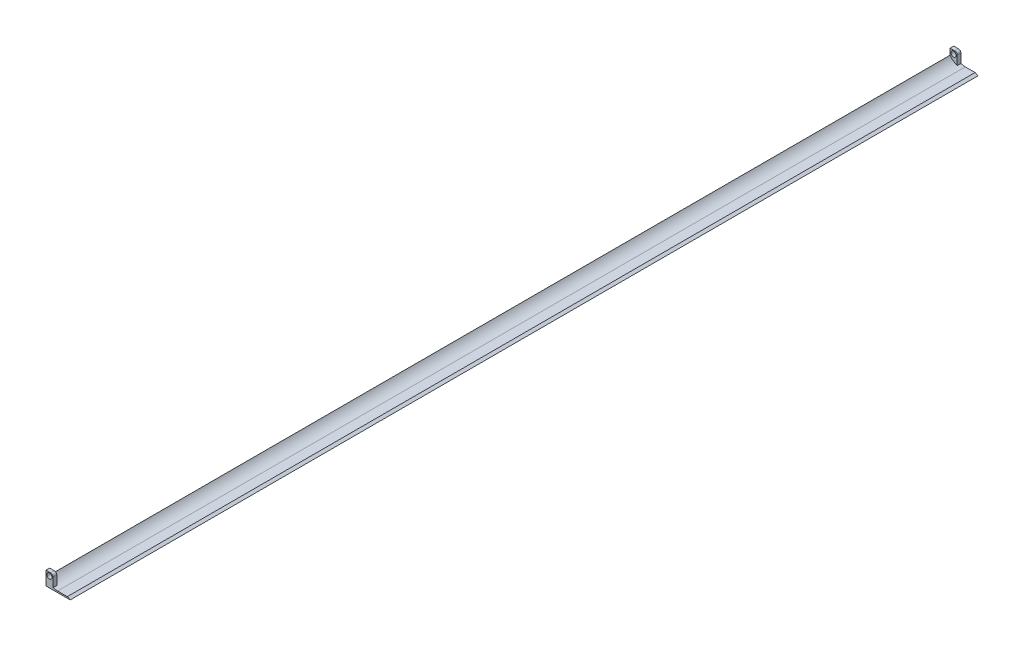
ISO-10303-21;
HEADER;
FILE_DESCRIPTION(('STEP AP214'),'2;1');
FILE_NAME('part.step','',(''),(''),'','','');
FILE_SCHEMA(('AUTOMOTIVE_DESIGN { 1 0 10303 214 1 1 1 1 }'));
ENDSEC;
DATA;
#1=APPLICATION_CONTEXT('core data for automotive mechanical design processes');
#2=APPLICATION_PROTOCOL_DEFINITION('international standard','automotive_design',2000,#1);
#3=PRODUCT_CONTEXT('',#1,'mechanical');
#4=PRODUCT('Part','Part','',(#3));
#5=PRODUCT_RELATED_PRODUCT_CATEGORY('part','',(#4));
#6=PRODUCT_DEFINITION_FORMATION('','',#4);
#7=PRODUCT_DEFINITION_CONTEXT('part definition',#1,'design');
#8=PRODUCT_DEFINITION('design','',#6,#7);
#9=PRODUCT_DEFINITION_SHAPE('','',#8);
#10=(LENGTH_UNIT() NAMED_UNIT(*) SI_UNIT(.MILLI.,.METRE.));
#11=(NAMED_UNIT(*) PLANE_ANGLE_UNIT() SI_UNIT($,.RADIAN.));
#12=(NAMED_UNIT(*) SI_UNIT($,.STERADIAN.) SOLID_ANGLE_UNIT());
#13=UNCERTAINTY_MEASURE_WITH_UNIT(LENGTH_MEASURE(1.E-05),#10,'distance_accuracy_value','');
#14=(GEOMETRIC_REPRESENTATION_CONTEXT(3) GLOBAL_UNCERTAINTY_ASSIGNED_CONTEXT((#13)) GLOBAL_UNIT_ASSIGNED_CONTEXT((#10,
#11,#12)) REPRESENTATION_CONTEXT('',''));
#15=CARTESIAN_POINT('',(0.,0.,0.));
#16=DIRECTION('',(0.,0.,1.));
#17=DIRECTION('',(1.,0.,0.));
#18=AXIS2_PLACEMENT_3D('',#15,#16,#17);
#19=CARTESIAN_POINT('',(14.7341974301029,-2.48419378670969,939.8));
#20=DIRECTION('',(-0.447080270129041,-0.894493841265184,0.));
#21=DIRECTION('',(0.894493841265184,-0.447080270129041,0.));
#22=AXIS2_PLACEMENT_3D('',#19,#20,#21);
#23=PLANE('',#22);
#24=DIRECTION('',(-0.894493841265184,0.447080270129041,0.));
#25=VECTOR('',#24,1.);
#26=CARTESIAN_POINT('',(14.7341974301029,-2.48419378670969,0.));
#27=LINE('',#26,#25);
#28=CARTESIAN_POINT('',(17.7073283109132,-3.97020531188867,0.));
#29=VERTEX_POINT('',#28);
#30=CARTESIAN_POINT('',(14.7341974301029,-2.48419378670969,0.));
#31=VERTEX_POINT('',#30);
#32=EDGE_CURVE('E241',#29,#31,#27,.T.);
#33=ORIENTED_EDGE('',*,*,#32,.T.);
#34=DIRECTION('',(0.,0.,-1.));
#35=VECTOR('',#34,1.);
#36=CARTESIAN_POINT('',(14.7341974301029,-2.48419378670969,939.8));
#37=LINE('',#36,#35);
#38=CARTESIAN_POINT('',(14.7341974301029,-2.48419378670969,939.8));
#39=VERTEX_POINT('',#38);
#40=EDGE_CURVE('E47',#39,#31,#37,.T.);
#41=ORIENTED_EDGE('',*,*,#40,.F.);
#42=DIRECTION('',(-0.894493841265184,0.447080270129041,0.));
#43=VECTOR('',#42,1.);
#44=CARTESIAN_POINT('',(14.7341974301029,-2.48419378670969,939.8));
#45=LINE('',#44,#43);
#46=CARTESIAN_POINT('',(17.7073283109132,-3.97020531188867,939.8));
#47=VERTEX_POINT('',#46);
#48=EDGE_CURVE('E245',#47,#39,#45,.T.);
#49=ORIENTED_EDGE('',*,*,#48,.F.);
#50=DIRECTION('',(0.,0.,-1.));
#51=VECTOR('',#50,1.);
#52=CARTESIAN_POINT('',(17.7073283109132,-3.97020531188867,939.8));
#53=LINE('',#52,#51);
#54=EDGE_CURVE('E11',#47,#29,#53,.T.);
#55=ORIENTED_EDGE('',*,*,#54,.T.);
#56=EDGE_LOOP('',(#33,#41,#49,#55));
#57=FACE_BOUND('',#56,.T.);
#58=ADVANCED_FACE('F39',(#57),#23,.F.);
#59=CARTESIAN_POINT('',(4.5846287213783,-2.48419378670969,939.8));
#60=DIRECTION('',(0.,-1.,0.));
#61=DIRECTION('',(0.,0.,-1.));
#62=AXIS2_PLACEMENT_3D('',#59,#60,#61);
#63=PLANE('',#62);
#64=DIRECTION('',(-1.,0.,0.));
#65=VECTOR('',#64,1.);
#66=CARTESIAN_POINT('',(4.5846287213783,-2.48419378670969,0.));
#67=LINE('',#66,#65);
#68=CARTESIAN_POINT('',(4.5846287213783,-2.48419378670969,0.));
#69=VERTEX_POINT('',#68);
#70=EDGE_CURVE('E263',#31,#69,#67,.T.);
#71=ORIENTED_EDGE('',*,*,#70,.T.);
#72=DIRECTION('',(0.,0.,-1.));
#73=VECTOR('',#72,1.);
#74=CARTESIAN_POINT('',(4.5846287213783,-2.48419378670969,939.8));
#75=LINE('',#74,#73);
#76=CARTESIAN_POINT('',(4.5846287213783,-2.48419378670969,939.8));
#77=VERTEX_POINT('',#76);
#78=EDGE_CURVE('E278',#77,#69,#75,.T.);
#79=ORIENTED_EDGE('',*,*,#78,.F.);
#80=DIRECTION('',(-1.,0.,0.));
#81=VECTOR('',#80,1.);
#82=CARTESIAN_POINT('',(4.5846287213783,-2.48419378670969,939.8));
#83=LINE('',#82,#81);
#84=EDGE_CURVE('E249',#39,#77,#83,.T.);
#85=ORIENTED_EDGE('',*,*,#84,.F.);
#86=ORIENTED_EDGE('',*,*,#40,.T.);
#87=EDGE_LOOP('',(#71,#79,#85,#86));
#88=FACE_BOUND('',#87,.T.);
#89=ADVANCED_FACE('F287',(#88),#63,.F.);
#90=CARTESIAN_POINT('',(4.5846287213783,11.8402798061839,939.8));
#91=DIRECTION('',(0.,0.,-1.));
#92=DIRECTION('',(-1.,0.,0.));
#93=AXIS2_PLACEMENT_3D('',#90,#91,#92);
#94=CYLINDRICAL_SURFACE('',#93,14.3244735928936);
#95=CARTESIAN_POINT('',(4.5846287213783,11.8402798061839,0.));
#96=DIRECTION('',(0.,0.,-1.));
#97=DIRECTION('',(1.,0.,0.));
#98=AXIS2_PLACEMENT_3D('',#95,#96,#97);
#99=CIRCLE('',#98,14.3244735928936);
#100=CARTESIAN_POINT('',(0.,-1.73070848504306,0.));
#101=VERTEX_POINT('',#100);
#102=EDGE_CURVE('E266',#69,#101,#99,.T.);
#103=ORIENTED_EDGE('',*,*,#102,.T.);
#104=DIRECTION('',(0.,0.,-1.));
#105=VECTOR('',#104,1.);
#106=CARTESIAN_POINT('',(0.,-1.73070848504305,939.8));
#107=LINE('',#106,#105);
#108=CARTESIAN_POINT('',(0.,-1.73070848504306,3.80999999999998));
#109=VERTEX_POINT('',#108);
#110=EDGE_CURVE('E54',#101,#109,#107,.F.);
#111=ORIENTED_EDGE('',*,*,#110,.T.);
#112=CARTESIAN_POINT('',(4.5846287213783,11.8402798061839,3.80999999999998));
#113=DIRECTION('',(0.,0.,-1.));
#114=DIRECTION('',(-1.,0.,0.));
#115=AXIS2_PLACEMENT_3D('',#112,#113,#114);
#116=CIRCLE('',#115,14.3244735928936);
#117=CARTESIAN_POINT('',(-7.36024980483996,3.93392661982825,3.80999999999998));
#118=VERTEX_POINT('',#117);
#119=EDGE_CURVE('E58',#118,#109,#116,.F.);
#120=ORIENTED_EDGE('',*,*,#119,.F.);
#121=DIRECTION('',(0.,0.,-1.));
#122=VECTOR('',#121,1.);
#123=CARTESIAN_POINT('',(-7.36024980483996,3.93392661982825,939.8));
#124=LINE('',#123,#122);
#125=CARTESIAN_POINT('',(-7.36024980483996,3.93392661982825,935.99));
#126=VERTEX_POINT('',#125);
#127=EDGE_CURVE('E140',#126,#118,#124,.T.);
#128=ORIENTED_EDGE('',*,*,#127,.F.);
#129=CARTESIAN_POINT('',(4.5846287213783,11.8402798061839,935.99));
#130=DIRECTION('',(0.,0.,1.));
#131=DIRECTION('',(1.,0.,0.));
#132=AXIS2_PLACEMENT_3D('',#129,#130,#131);
#133=CIRCLE('',#132,14.3244735928936);
#134=CARTESIAN_POINT('',(0.,-1.73070848504306,935.99));
#135=VERTEX_POINT('',#134);
#136=EDGE_CURVE('E238',#135,#126,#133,.F.);
#137=ORIENTED_EDGE('',*,*,#136,.F.);
#138=DIRECTION('',(0.,0.,-1.));
#139=VECTOR('',#138,1.);
#140=CARTESIAN_POINT('',(0.,-1.73070848504305,939.8));
#141=LINE('',#140,#139);
#142=CARTESIAN_POINT('',(0.,-1.73070848504306,939.8));
#143=VERTEX_POINT('',#142);
#144=EDGE_CURVE('E228',#135,#143,#141,.F.);
#145=ORIENTED_EDGE('',*,*,#144,.T.);
#146=CARTESIAN_POINT('',(4.5846287213783,11.8402798061839,939.8));
#147=DIRECTION('',(0.,0.,-1.));
#148=DIRECTION('',(1.,0.,0.));
#149=AXIS2_PLACEMENT_3D('',#146,#147,#148);
#150=CIRCLE('',#149,14.3244735928936);
#151=EDGE_CURVE('E252',#77,#143,#150,.T.);
#152=ORIENTED_EDGE('',*,*,#151,.F.);
#153=ORIENTED_EDGE('',*,*,#78,.T.);
#154=EDGE_LOOP('',(#103,#111,#120,#128,#137,#145,#152,#153));
#155=FACE_BOUND('',#154,.T.);
#156=ADVANCED_FACE('F297',(#155),#94,.F.);
#157=CARTESIAN_POINT('',(-7.36024980483996,3.93392661982825,939.8));
#158=DIRECTION('',(1.,0.,0.));
#159=DIRECTION('',(0.,1.,0.));
#160=AXIS2_PLACEMENT_3D('',#157,#158,#159);
#161=PLANE('',#160);
#162=DIRECTION('',(0.,-1.,0.));
#163=VECTOR('',#162,1.);
#164=CARTESIAN_POINT('',(-7.36024980483996,3.93392661982825,0.));
#165=LINE('',#164,#163);
#166=CARTESIAN_POINT('',(-7.36024980483996,10.1800682991331,0.));
#167=VERTEX_POINT('',#166);
#168=CARTESIAN_POINT('',(-7.36024980483996,-3.97020531188867,0.));
#169=VERTEX_POINT('',#168);
#170=EDGE_CURVE('E269',#167,#169,#165,.T.);
#171=ORIENTED_EDGE('',*,*,#170,.T.);
#172=DIRECTION('',(0.,0.,-1.));
#173=VECTOR('',#172,1.);
#174=CARTESIAN_POINT('',(-7.36024980483996,-3.97020531188867,939.8));
#175=LINE('',#174,#173);
#176=CARTESIAN_POINT('',(-7.36024980483996,-3.97020531188867,939.8));
#177=VERTEX_POINT('',#176);
#178=EDGE_CURVE('E260',#177,#169,#175,.T.);
#179=ORIENTED_EDGE('',*,*,#178,.F.);
#180=DIRECTION('',(0.,-1.,0.));
#181=VECTOR('',#180,1.);
#182=CARTESIAN_POINT('',(-7.36024980483996,3.93392661982825,939.8));
#183=LINE('',#182,#181);
#184=CARTESIAN_POINT('',(-7.36024980483996,10.1800682991331,939.8));
#185=VERTEX_POINT('',#184);
#186=EDGE_CURVE('E256',#185,#177,#183,.T.);
#187=ORIENTED_EDGE('',*,*,#186,.F.);
#188=DIRECTION('',(0.,0.,1.));
#189=VECTOR('',#188,1.);
#190=CARTESIAN_POINT('',(-7.36024980483996,10.1800682991331,935.99));
#191=LINE('',#190,#189);
#192=CARTESIAN_POINT('',(-7.36024980483996,10.1800682991331,935.99));
#193=VERTEX_POINT('',#192);
#194=EDGE_CURVE('E224',#193,#185,#191,.T.);
#195=ORIENTED_EDGE('',*,*,#194,.F.);
#196=DIRECTION('',(0.,-1.,0.));
#197=VECTOR('',#196,1.);
#198=CARTESIAN_POINT('',(-7.36024980483996,-3.97020531188867,935.99));
#199=LINE('',#198,#197);
#200=EDGE_CURVE('E199',#193,#126,#199,.T.);
#201=ORIENTED_EDGE('',*,*,#200,.T.);
#202=ORIENTED_EDGE('',*,*,#127,.T.);
#203=DIRECTION('',(0.,1.,0.));
#204=VECTOR('',#203,1.);
#205=CARTESIAN_POINT('',(-7.36024980483996,-3.97020531188867,3.81));
#206=LINE('',#205,#204);
#207=CARTESIAN_POINT('',(-7.36024980483996,10.1800682991331,3.81));
#208=VERTEX_POINT('',#207);
#209=EDGE_CURVE('E133',#118,#208,#206,.T.);
#210=ORIENTED_EDGE('',*,*,#209,.T.);
#211=DIRECTION('',(0.,0.,-1.));
#212=VECTOR('',#211,1.);
#213=CARTESIAN_POINT('',(-7.36024980483996,10.1800682991331,3.81));
#214=LINE('',#213,#212);
#215=EDGE_CURVE('E137',#208,#167,#214,.T.);
#216=ORIENTED_EDGE('',*,*,#215,.T.);
#217=EDGE_LOOP('',(#171,#179,#187,#195,#201,#202,#210,#216));
#218=FACE_BOUND('',#217,.T.);
#219=ADVANCED_FACE('F136',(#218),#161,.F.);
#220=CARTESIAN_POINT('',(-7.36024980483996,-3.97020531188867,939.8));
#221=DIRECTION('',(0.,1.,0.));
#222=DIRECTION('',(-1.,0.,0.));
#223=AXIS2_PLACEMENT_3D('',#220,#221,#222);
#224=PLANE('',#223);
#225=DIRECTION('',(1.,0.,0.));
#226=VECTOR('',#225,1.);
#227=CARTESIAN_POINT('',(-7.36024980483996,-3.97020531188867,0.));
#228=LINE('',#227,#226);
#229=EDGE_CURVE('E246',#169,#29,#228,.T.);
#230=ORIENTED_EDGE('',*,*,#229,.T.);
#231=ORIENTED_EDGE('',*,*,#54,.F.);
#232=DIRECTION('',(1.,0.,0.));
#233=VECTOR('',#232,1.);
#234=CARTESIAN_POINT('',(17.7073283109132,-3.97020531188867,939.8));
#235=LINE('',#234,#233);
#236=EDGE_CURVE('E242',#177,#47,#235,.T.);
#237=ORIENTED_EDGE('',*,*,#236,.F.);
#238=ORIENTED_EDGE('',*,*,#178,.T.);
#239=EDGE_LOOP('',(#230,#231,#237,#238));
#240=FACE_BOUND('',#239,.T.);
#241=ADVANCED_FACE('F306',(#240),#224,.F.);
#242=CARTESIAN_POINT('',(4.5846287213783,11.8402798061839,939.8));
#243=DIRECTION('',(0.,0.,1.));
#244=DIRECTION('',(1.,0.,0.));
#245=AXIS2_PLACEMENT_3D('',#242,#243,#244);
#246=PLANE('',#245);
#247=ORIENTED_EDGE('',*,*,#151,.T.);
#248=DIRECTION('',(0.,1.,0.));
#249=VECTOR('',#248,1.);
#250=CARTESIAN_POINT('',(0.,-3.97020531188867,939.8));
#251=LINE('',#250,#249);
#252=CARTESIAN_POINT('',(0.,7.64006829913312,939.8));
#253=VERTEX_POINT('',#252);
#254=EDGE_CURVE('E195',#143,#253,#251,.T.);
#255=ORIENTED_EDGE('',*,*,#254,.T.);
#256=CARTESIAN_POINT('',(-2.54,7.64006829913314,939.8));
#257=DIRECTION('',(0.,0.,1.));
#258=DIRECTION('',(1.,0.,0.));
#259=AXIS2_PLACEMENT_3D('',#256,#257,#258);
#260=CIRCLE('',#259,2.54);
#261=CARTESIAN_POINT('',(-2.54000000000002,10.1800682991331,939.8));
#262=VERTEX_POINT('',#261);
#263=EDGE_CURVE('E217',#253,#262,#260,.T.);
#264=ORIENTED_EDGE('',*,*,#263,.T.);
#265=DIRECTION('',(-1.,0.,0.));
#266=VECTOR('',#265,1.);
#267=CARTESIAN_POINT('',(-7.36024980483996,10.1800682991331,939.8));
#268=LINE('',#267,#266);
#269=EDGE_CURVE('E203',#262,#185,#268,.T.);
#270=ORIENTED_EDGE('',*,*,#269,.T.);
#271=ORIENTED_EDGE('',*,*,#186,.T.);
#272=ORIENTED_EDGE('',*,*,#236,.T.);
#273=ORIENTED_EDGE('',*,*,#48,.T.);
#274=ORIENTED_EDGE('',*,*,#84,.T.);
#275=EDGE_LOOP('',(#247,#255,#264,#270,#271,#272,#273,#274));
#276=FACE_BOUND('',#275,.T.);
#277=CARTESIAN_POINT('',(-3.81,6.74121463810673,939.8));
#278=DIRECTION('',(0.,0.,1.));
#279=DIRECTION('',(1.,0.,0.));
#280=AXIS2_PLACEMENT_3D('',#277,#278,#279);
#281=CIRCLE('',#280,2.667);
#282=CARTESIAN_POINT('',(-1.143,6.74121463810673,939.8));
#283=VERTEX_POINT('',#282);
#284=EDGE_CURVE('E190',#283,#283,#281,.T.);
#285=ORIENTED_EDGE('',*,*,#284,.F.);
#286=EDGE_LOOP('',(#285));
#287=FACE_BOUND('',#286,.T.);
#288=ADVANCED_FACE('F309',(#276,#287),#246,.T.);
#289=CARTESIAN_POINT('',(4.5846287213783,11.8402798061839,0.));
#290=DIRECTION('',(0.,0.,1.));
#291=DIRECTION('',(1.,0.,0.));
#292=AXIS2_PLACEMENT_3D('',#289,#290,#291);
#293=PLANE('',#292);
#294=ORIENTED_EDGE('',*,*,#32,.F.);
#295=ORIENTED_EDGE('',*,*,#229,.F.);
#296=ORIENTED_EDGE('',*,*,#170,.F.);
#297=DIRECTION('',(1.,0.,0.));
#298=VECTOR('',#297,1.);
#299=CARTESIAN_POINT('',(-7.36024980483996,10.1800682991331,0.));
#300=LINE('',#299,#298);
#301=CARTESIAN_POINT('',(-2.54000000000002,10.1800682991331,0.));
#302=VERTEX_POINT('',#301);
#303=EDGE_CURVE('E151',#167,#302,#300,.T.);
#304=ORIENTED_EDGE('',*,*,#303,.T.);
#305=CARTESIAN_POINT('',(-2.54,7.64006829913314,0.));
#306=DIRECTION('',(0.,0.,-1.));
#307=DIRECTION('',(-1.,0.,0.));
#308=AXIS2_PLACEMENT_3D('',#305,#306,#307);
#309=CIRCLE('',#308,2.54);
#310=CARTESIAN_POINT('',(0.,7.64006829913312,0.));
#311=VERTEX_POINT('',#310);
#312=EDGE_CURVE('E172',#302,#311,#309,.T.);
#313=ORIENTED_EDGE('',*,*,#312,.T.);
#314=DIRECTION('',(0.,-1.,0.));
#315=VECTOR('',#314,1.);
#316=CARTESIAN_POINT('',(0.,-1.73070848504305,0.));
#317=LINE('',#316,#315);
#318=EDGE_CURVE('E145',#311,#101,#317,.T.);
#319=ORIENTED_EDGE('',*,*,#318,.T.);
#320=ORIENTED_EDGE('',*,*,#102,.F.);
#321=ORIENTED_EDGE('',*,*,#70,.F.);
#322=EDGE_LOOP('',(#294,#295,#296,#304,#313,#319,#320,#321));
#323=FACE_BOUND('',#322,.T.);
#324=CARTESIAN_POINT('',(-3.81,6.74121463810673,0.));
#325=DIRECTION('',(0.,0.,-1.));
#326=DIRECTION('',(-1.,0.,0.));
#327=AXIS2_PLACEMENT_3D('',#324,#325,#326);
#328=CIRCLE('',#327,2.667);
#329=CARTESIAN_POINT('',(-6.477,6.74121463810673,0.));
#330=VERTEX_POINT('',#329);
#331=EDGE_CURVE('E375',#330,#330,#328,.T.);
#332=ORIENTED_EDGE('',*,*,#331,.F.);
#333=EDGE_LOOP('',(#332));
#334=FACE_BOUND('',#333,.T.);
#335=ADVANCED_FACE('F294',(#323,#334),#293,.F.);
#336=CARTESIAN_POINT('',(-2.54,7.64006829913314,935.99));
#337=DIRECTION('',(0.,0.,1.));
#338=DIRECTION('',(1.,0.,0.));
#339=AXIS2_PLACEMENT_3D('',#336,#337,#338);
#340=PLANE('',#339);
#341=CARTESIAN_POINT('',(-3.81,6.74121463810673,935.99));
#342=DIRECTION('',(0.,0.,1.));
#343=DIRECTION('',(1.,0.,0.));
#344=AXIS2_PLACEMENT_3D('',#341,#342,#343);
#345=CIRCLE('',#344,2.667);
#346=CARTESIAN_POINT('',(-1.143,6.74121463810673,935.99));
#347=VERTEX_POINT('',#346);
#348=EDGE_CURVE('E191',#347,#347,#345,.T.);
#349=ORIENTED_EDGE('',*,*,#348,.T.);
#350=EDGE_LOOP('',(#349));
#351=FACE_BOUND('',#350,.T.);
#352=DIRECTION('',(0.,1.,0.));
#353=VECTOR('',#352,1.);
#354=CARTESIAN_POINT('',(0.,-3.97020531188867,935.99));
#355=LINE('',#354,#353);
#356=CARTESIAN_POINT('',(0.,7.64006829913312,935.99));
#357=VERTEX_POINT('',#356);
#358=EDGE_CURVE('E202',#135,#357,#355,.T.);
#359=ORIENTED_EDGE('',*,*,#358,.F.);
#360=ORIENTED_EDGE('',*,*,#136,.T.);
#361=ORIENTED_EDGE('',*,*,#200,.F.);
#362=DIRECTION('',(-1.,0.,0.));
#363=VECTOR('',#362,1.);
#364=CARTESIAN_POINT('',(-7.36024980483996,10.1800682991331,935.99));
#365=LINE('',#364,#363);
#366=CARTESIAN_POINT('',(-2.54000000000002,10.1800682991331,935.99));
#367=VERTEX_POINT('',#366);
#368=EDGE_CURVE('E210',#367,#193,#365,.T.);
#369=ORIENTED_EDGE('',*,*,#368,.F.);
#370=CARTESIAN_POINT('',(-2.54,7.64006829913314,935.99));
#371=DIRECTION('',(0.,0.,1.));
#372=DIRECTION('',(1.,0.,0.));
#373=AXIS2_PLACEMENT_3D('',#370,#371,#372);
#374=CIRCLE('',#373,2.54);
#375=EDGE_CURVE('E206',#357,#367,#374,.T.);
#376=ORIENTED_EDGE('',*,*,#375,.F.);
#377=EDGE_LOOP('',(#359,#360,#361,#369,#376));
#378=FACE_BOUND('',#377,.T.);
#379=ADVANCED_FACE('F319',(#351,#378),#340,.F.);
#380=CARTESIAN_POINT('',(0.,-3.97020531188867,935.99));
#381=DIRECTION('',(1.,0.,0.));
#382=DIRECTION('',(0.,0.,-1.));
#383=AXIS2_PLACEMENT_3D('',#380,#381,#382);
#384=PLANE('',#383);
#385=ORIENTED_EDGE('',*,*,#144,.F.);
#386=ORIENTED_EDGE('',*,*,#358,.T.);
#387=DIRECTION('',(0.,0.,1.));
#388=VECTOR('',#387,1.);
#389=CARTESIAN_POINT('',(0.,7.64006829913312,935.99));
#390=LINE('',#389,#388);
#391=EDGE_CURVE('E214',#357,#253,#390,.T.);
#392=ORIENTED_EDGE('',*,*,#391,.T.);
#393=ORIENTED_EDGE('',*,*,#254,.F.);
#394=EDGE_LOOP('',(#385,#386,#392,#393));
#395=FACE_BOUND('',#394,.T.);
#396=ADVANCED_FACE('F340',(#395),#384,.T.);
#397=CARTESIAN_POINT('',(-7.36024980483996,10.1800682991331,935.99));
#398=DIRECTION('',(0.,1.,0.));
#399=DIRECTION('',(0.,0.,1.));
#400=AXIS2_PLACEMENT_3D('',#397,#398,#399);
#401=PLANE('',#400);
#402=ORIENTED_EDGE('',*,*,#269,.F.);
#403=DIRECTION('',(0.,0.,1.));
#404=VECTOR('',#403,1.);
#405=CARTESIAN_POINT('',(-2.54000000000002,10.1800682991331,935.99));
#406=LINE('',#405,#404);
#407=EDGE_CURVE('E229',#367,#262,#406,.T.);
#408=ORIENTED_EDGE('',*,*,#407,.F.);
#409=ORIENTED_EDGE('',*,*,#368,.T.);
#410=ORIENTED_EDGE('',*,*,#194,.T.);
#411=EDGE_LOOP('',(#402,#408,#409,#410));
#412=FACE_BOUND('',#411,.T.);
#413=ADVANCED_FACE('F314',(#412),#401,.T.);
#414=CARTESIAN_POINT('',(-2.54,7.64006829913314,935.99));
#415=DIRECTION('',(0.,0.,1.));
#416=DIRECTION('',(1.,0.,0.));
#417=AXIS2_PLACEMENT_3D('',#414,#415,#416);
#418=CYLINDRICAL_SURFACE('',#417,2.54);
#419=ORIENTED_EDGE('',*,*,#263,.F.);
#420=ORIENTED_EDGE('',*,*,#391,.F.);
#421=ORIENTED_EDGE('',*,*,#375,.T.);
#422=ORIENTED_EDGE('',*,*,#407,.T.);
#423=EDGE_LOOP('',(#419,#420,#421,#422));
#424=FACE_BOUND('',#423,.T.);
#425=ADVANCED_FACE('F343',(#424),#418,.T.);
#426=CARTESIAN_POINT('',(-3.81,6.74121463810673,935.99));
#427=DIRECTION('',(0.,0.,1.));
#428=DIRECTION('',(1.,0.,0.));
#429=AXIS2_PLACEMENT_3D('',#426,#427,#428);
#430=CYLINDRICAL_SURFACE('',#429,2.667);
#431=CARTESIAN_POINT('',(-1.143,6.74121463810673,935.99));
#432=CARTESIAN_POINT('',(-1.143,6.74121463810673,936.0296875));
#433=CARTESIAN_POINT('',(-1.143,6.74121463810673,936.069375));
#434=CARTESIAN_POINT('',(-1.143,6.74121463810673,936.14875));
#435=CARTESIAN_POINT('',(-1.143,6.74121463810673,936.1884375));
#436=CARTESIAN_POINT('',(-1.143,6.74121463810673,936.2678125));
#437=CARTESIAN_POINT('',(-1.143,6.74121463810673,936.3075));
#438=CARTESIAN_POINT('',(-1.143,6.74121463810673,936.386875));
#439=CARTESIAN_POINT('',(-1.143,6.74121463810673,936.4265625));
#440=CARTESIAN_POINT('',(-1.143,6.74121463810673,936.5059375));
#441=CARTESIAN_POINT('',(-1.143,6.74121463810673,936.545625));
#442=CARTESIAN_POINT('',(-1.143,6.74121463810673,936.625));
#443=CARTESIAN_POINT('',(-1.143,6.74121463810673,936.6646875));
#444=CARTESIAN_POINT('',(-1.143,6.74121463810673,936.7440625));
#445=CARTESIAN_POINT('',(-1.143,6.74121463810673,936.78375));
#446=CARTESIAN_POINT('',(-1.143,6.74121463810673,936.863125));
#447=CARTESIAN_POINT('',(-1.143,6.74121463810673,936.9028125));
#448=CARTESIAN_POINT('',(-1.143,6.74121463810673,936.9821875));
#449=CARTESIAN_POINT('',(-1.143,6.74121463810673,937.021875));
#450=CARTESIAN_POINT('',(-1.143,6.74121463810673,937.10125));
#451=CARTESIAN_POINT('',(-1.143,6.74121463810673,937.1409375));
#452=CARTESIAN_POINT('',(-1.143,6.74121463810673,937.2203125));
#453=CARTESIAN_POINT('',(-1.143,6.74121463810673,937.26));
#454=CARTESIAN_POINT('',(-1.143,6.74121463810673,937.339375));
#455=CARTESIAN_POINT('',(-1.143,6.74121463810673,937.3790625));
#456=CARTESIAN_POINT('',(-1.143,6.74121463810673,937.4584375));
#457=CARTESIAN_POINT('',(-1.143,6.74121463810673,937.498125));
#458=CARTESIAN_POINT('',(-1.143,6.74121463810673,937.5775));
#459=CARTESIAN_POINT('',(-1.143,6.74121463810673,937.6171875));
#460=CARTESIAN_POINT('',(-1.143,6.74121463810673,937.6965625));
#461=CARTESIAN_POINT('',(-1.143,6.74121463810673,937.73625));
#462=CARTESIAN_POINT('',(-1.143,6.74121463810673,937.815625));
#463=CARTESIAN_POINT('',(-1.143,6.74121463810673,937.8553125));
#464=CARTESIAN_POINT('',(-1.143,6.74121463810673,937.9346875));
#465=CARTESIAN_POINT('',(-1.143,6.74121463810673,937.974375));
#466=CARTESIAN_POINT('',(-1.143,6.74121463810673,938.05375));
#467=CARTESIAN_POINT('',(-1.143,6.74121463810673,938.0934375));
#468=CARTESIAN_POINT('',(-1.143,6.74121463810673,938.1728125));
#469=CARTESIAN_POINT('',(-1.143,6.74121463810673,938.2125));
#470=CARTESIAN_POINT('',(-1.143,6.74121463810673,938.291875));
#471=CARTESIAN_POINT('',(-1.143,6.74121463810673,938.3315625));
#472=CARTESIAN_POINT('',(-1.143,6.74121463810673,938.4109375));
#473=CARTESIAN_POINT('',(-1.143,6.74121463810673,938.450625));
#474=CARTESIAN_POINT('',(-1.143,6.74121463810673,938.53));
#475=CARTESIAN_POINT('',(-1.143,6.74121463810673,938.5696875));
#476=CARTESIAN_POINT('',(-1.143,6.74121463810673,938.6490625));
#477=CARTESIAN_POINT('',(-1.143,6.74121463810673,938.68875));
#478=CARTESIAN_POINT('',(-1.143,6.74121463810673,938.768125));
#479=CARTESIAN_POINT('',(-1.143,6.74121463810673,938.8078125));
#480=CARTESIAN_POINT('',(-1.143,6.74121463810673,938.8871875));
#481=CARTESIAN_POINT('',(-1.143,6.74121463810673,938.926875));
#482=CARTESIAN_POINT('',(-1.143,6.74121463810673,939.00625));
#483=CARTESIAN_POINT('',(-1.143,6.74121463810673,939.0459375));
#484=CARTESIAN_POINT('',(-1.143,6.74121463810673,939.1253125));
#485=CARTESIAN_POINT('',(-1.143,6.74121463810673,939.165));
#486=CARTESIAN_POINT('',(-1.143,6.74121463810673,939.244375));
#487=CARTESIAN_POINT('',(-1.143,6.74121463810673,939.2840625));
#488=CARTESIAN_POINT('',(-1.143,6.74121463810673,939.3634375));
#489=CARTESIAN_POINT('',(-1.143,6.74121463810673,939.403125));
#490=CARTESIAN_POINT('',(-1.143,6.74121463810673,939.4825));
#491=CARTESIAN_POINT('',(-1.143,6.74121463810673,939.5221875));
#492=CARTESIAN_POINT('',(-1.143,6.74121463810673,939.6015625));
#493=CARTESIAN_POINT('',(-1.143,6.74121463810673,939.64125));
#494=CARTESIAN_POINT('',(-1.143,6.74121463810673,939.720625));
#495=CARTESIAN_POINT('',(-1.143,6.74121463810673,939.7603125));
#496=CARTESIAN_POINT('',(-1.143,6.74121463810673,939.8));
#497=B_SPLINE_CURVE_WITH_KNOTS('',3,(#431,#432,#433,#434,#435,#436,#437,#438,#439,#440,#441,
#442,#443,#444,#445,#446,#447,#448,#449,#450,#451,#452,#453,#454,#455,#456,#457,#458,#459,#460,
#461,#462,#463,#464,#465,#466,#467,#468,#469,#470,#471,#472,#473,#474,#475,#476,#477,#478,#479,
#480,#481,#482,#483,#484,#485,#486,#487,#488,#489,#490,#491,#492,#493,#494,#495,#496),
.UNSPECIFIED.,.F.,.F.,(4,2,2,2,2,2,2,2,2,2,2,2,2,2,2,2,2,2,2,2,2,2,2,2,2,2,2,2,2,2,2,2,4),(0.,
0.119062499999933,0.238124999999978,0.357187499999911,0.476249999999956,0.595312499999889,
0.714374999999934,0.833437499999978,0.952499999999912,1.07156249999996,1.19062499999989,
1.30968749999993,1.42874999999998,1.54781249999991,1.66687499999996,1.78593749999989,
1.90499999999993,2.02406249999998,2.14312499999991,2.26218749999996,2.38124999999989,
2.50031249999993,2.61937499999998,2.73843749999991,2.85749999999996,2.97656249999989,
3.09562499999994,3.21468749999998,3.33374999999991,3.45281249999996,3.57187499999989,
3.69093749999994,3.80999999999987),.UNSPECIFIED.);
#498=EDGE_CURVE('BSEAM346',#347,#283,#497,.T.);
#499=ORIENTED_EDGE('',*,*,#348,.F.);
#500=ORIENTED_EDGE('',*,*,#284,.T.);
#501=ORIENTED_EDGE('',*,*,#498,.T.);
#502=ORIENTED_EDGE('',*,*,#498,.F.);
#503=EDGE_LOOP('',(#499,#501,#500,#502));
#504=FACE_BOUND('',#503,.T.);
#505=ADVANCED_FACE('F346',(#504),#430,.F.);
#506=CARTESIAN_POINT('',(-2.54,7.64006829913314,3.81));
#507=DIRECTION('',(0.,0.,-1.));
#508=DIRECTION('',(-1.,0.,0.));
#509=AXIS2_PLACEMENT_3D('',#506,#507,#508);
#510=PLANE('',#509);
#511=CARTESIAN_POINT('',(-3.81,6.74121463810673,3.81));
#512=DIRECTION('',(0.,0.,-1.));
#513=DIRECTION('',(-1.,0.,0.));
#514=AXIS2_PLACEMENT_3D('',#511,#512,#513);
#515=CIRCLE('',#514,2.667);
#516=CARTESIAN_POINT('',(-6.477,6.74121463810673,3.81));
#517=VERTEX_POINT('',#516);
#518=EDGE_CURVE('E173',#517,#517,#515,.T.);
#519=ORIENTED_EDGE('',*,*,#518,.T.);
#520=EDGE_LOOP('',(#519));
#521=FACE_BOUND('',#520,.T.);
#522=ORIENTED_EDGE('',*,*,#209,.F.);
#523=ORIENTED_EDGE('',*,*,#119,.T.);
#524=DIRECTION('',(0.,-1.,0.));
#525=VECTOR('',#524,1.);
#526=CARTESIAN_POINT('',(0.,7.64006829913312,3.81));
#527=LINE('',#526,#525);
#528=CARTESIAN_POINT('',(0.,7.64006829913312,3.81));
#529=VERTEX_POINT('',#528);
#530=EDGE_CURVE('E154',#529,#109,#527,.T.);
#531=ORIENTED_EDGE('',*,*,#530,.F.);
#532=CARTESIAN_POINT('',(-2.54,7.64006829913314,3.81));
#533=DIRECTION('',(0.,0.,-1.));
#534=DIRECTION('',(-1.,0.,0.));
#535=AXIS2_PLACEMENT_3D('',#532,#533,#534);
#536=CIRCLE('',#535,2.54);
#537=CARTESIAN_POINT('',(-2.54000000000002,10.1800682991331,3.81));
#538=VERTEX_POINT('',#537);
#539=EDGE_CURVE('E160',#538,#529,#536,.T.);
#540=ORIENTED_EDGE('',*,*,#539,.F.);
#541=DIRECTION('',(1.,0.,0.));
#542=VECTOR('',#541,1.);
#543=CARTESIAN_POINT('',(-7.36024980483996,10.1800682991331,3.81));
#544=LINE('',#543,#542);
#545=EDGE_CURVE('E144',#208,#538,#544,.T.);
#546=ORIENTED_EDGE('',*,*,#545,.F.);
#547=EDGE_LOOP('',(#522,#523,#531,#540,#546));
#548=FACE_BOUND('',#547,.T.);
#549=ADVANCED_FACE('F157',(#521,#548),#510,.F.);
#550=CARTESIAN_POINT('',(0.,-1.73070848504305,3.81));
#551=DIRECTION('',(1.,0.,0.));
#552=DIRECTION('',(0.,1.,0.));
#553=AXIS2_PLACEMENT_3D('',#550,#551,#552);
#554=PLANE('',#553);
#555=ORIENTED_EDGE('',*,*,#110,.F.);
#556=ORIENTED_EDGE('',*,*,#318,.F.);
#557=DIRECTION('',(0.,0.,-1.));
#558=VECTOR('',#557,1.);
#559=CARTESIAN_POINT('',(0.,7.64006829913312,3.81));
#560=LINE('',#559,#558);
#561=EDGE_CURVE('E180',#529,#311,#560,.T.);
#562=ORIENTED_EDGE('',*,*,#561,.F.);
#563=ORIENTED_EDGE('',*,*,#530,.T.);
#564=EDGE_LOOP('',(#555,#556,#562,#563));
#565=FACE_BOUND('',#564,.T.);
#566=ADVANCED_FACE('F300',(#565),#554,.T.);
#567=CARTESIAN_POINT('',(-2.54,7.64006829913314,3.81));
#568=DIRECTION('',(0.,0.,-1.));
#569=DIRECTION('',(-1.,0.,0.));
#570=AXIS2_PLACEMENT_3D('',#567,#568,#569);
#571=CYLINDRICAL_SURFACE('',#570,2.54);
#572=ORIENTED_EDGE('',*,*,#312,.F.);
#573=DIRECTION('',(0.,0.,-1.));
#574=VECTOR('',#573,1.);
#575=CARTESIAN_POINT('',(-2.54000000000002,10.1800682991331,3.81));
#576=LINE('',#575,#574);
#577=EDGE_CURVE('E153',#538,#302,#576,.T.);
#578=ORIENTED_EDGE('',*,*,#577,.F.);
#579=ORIENTED_EDGE('',*,*,#539,.T.);
#580=ORIENTED_EDGE('',*,*,#561,.T.);
#581=EDGE_LOOP('',(#572,#578,#579,#580));
#582=FACE_BOUND('',#581,.T.);
#583=ADVANCED_FACE('F303',(#582),#571,.T.);
#584=CARTESIAN_POINT('',(-7.36024980483996,10.1800682991331,3.81));
#585=DIRECTION('',(0.,1.,0.));
#586=DIRECTION('',(0.,0.,1.));
#587=AXIS2_PLACEMENT_3D('',#584,#585,#586);
#588=PLANE('',#587);
#589=ORIENTED_EDGE('',*,*,#303,.F.);
#590=ORIENTED_EDGE('',*,*,#215,.F.);
#591=ORIENTED_EDGE('',*,*,#545,.T.);
#592=ORIENTED_EDGE('',*,*,#577,.T.);
#593=EDGE_LOOP('',(#589,#590,#591,#592));
#594=FACE_BOUND('',#593,.T.);
#595=ADVANCED_FACE('F149',(#594),#588,.T.);
#596=CARTESIAN_POINT('',(-3.81,6.74121463810673,3.81));
#597=DIRECTION('',(0.,0.,-1.));
#598=DIRECTION('',(-1.,0.,0.));
#599=AXIS2_PLACEMENT_3D('',#596,#597,#598);
#600=CYLINDRICAL_SURFACE('',#599,2.667);
#601=CARTESIAN_POINT('',(-6.477,6.74121463810673,3.81));
#602=CARTESIAN_POINT('',(-6.477,6.74121463810673,3.7703125));
#603=CARTESIAN_POINT('',(-6.477,6.74121463810673,3.730625));
#604=CARTESIAN_POINT('',(-6.477,6.74121463810673,3.65125));
#605=CARTESIAN_POINT('',(-6.477,6.74121463810673,3.6115625));
#606=CARTESIAN_POINT('',(-6.477,6.74121463810673,3.5321875));
#607=CARTESIAN_POINT('',(-6.477,6.74121463810673,3.4925));
#608=CARTESIAN_POINT('',(-6.477,6.74121463810673,3.413125));
#609=CARTESIAN_POINT('',(-6.477,6.74121463810673,3.3734375));
#610=CARTESIAN_POINT('',(-6.477,6.74121463810673,3.2940625));
#611=CARTESIAN_POINT('',(-6.477,6.74121463810673,3.254375));
#612=CARTESIAN_POINT('',(-6.477,6.74121463810673,3.175));
#613=CARTESIAN_POINT('',(-6.477,6.74121463810673,3.1353125));
#614=CARTESIAN_POINT('',(-6.477,6.74121463810673,3.0559375));
#615=CARTESIAN_POINT('',(-6.477,6.74121463810673,3.01625));
#616=CARTESIAN_POINT('',(-6.477,6.74121463810673,2.936875));
#617=CARTESIAN_POINT('',(-6.477,6.74121463810673,2.8971875));
#618=CARTESIAN_POINT('',(-6.477,6.74121463810673,2.8178125));
#619=CARTESIAN_POINT('',(-6.477,6.74121463810673,2.778125));
#620=CARTESIAN_POINT('',(-6.477,6.74121463810673,2.69875));
#621=CARTESIAN_POINT('',(-6.477,6.74121463810673,2.6590625));
#622=CARTESIAN_POINT('',(-6.477,6.74121463810673,2.5796875));
#623=CARTESIAN_POINT('',(-6.477,6.74121463810673,2.54));
#624=CARTESIAN_POINT('',(-6.477,6.74121463810673,2.460625));
#625=CARTESIAN_POINT('',(-6.477,6.74121463810673,2.4209375));
#626=CARTESIAN_POINT('',(-6.477,6.74121463810673,2.3415625));
#627=CARTESIAN_POINT('',(-6.477,6.74121463810673,2.301875));
#628=CARTESIAN_POINT('',(-6.477,6.74121463810673,2.2225));
#629=CARTESIAN_POINT('',(-6.477,6.74121463810673,2.1828125));
#630=CARTESIAN_POINT('',(-6.477,6.74121463810673,2.1034375));
#631=CARTESIAN_POINT('',(-6.477,6.74121463810673,2.06375));
#632=CARTESIAN_POINT('',(-6.477,6.74121463810673,1.984375));
#633=CARTESIAN_POINT('',(-6.477,6.74121463810673,1.9446875));
#634=CARTESIAN_POINT('',(-6.477,6.74121463810673,1.8653125));
#635=CARTESIAN_POINT('',(-6.477,6.74121463810673,1.825625));
#636=CARTESIAN_POINT('',(-6.477,6.74121463810673,1.74625));
#637=CARTESIAN_POINT('',(-6.477,6.74121463810673,1.7065625));
#638=CARTESIAN_POINT('',(-6.477,6.74121463810673,1.6271875));
#639=CARTESIAN_POINT('',(-6.477,6.74121463810673,1.5875));
#640=CARTESIAN_POINT('',(-6.477,6.74121463810673,1.508125));
#641=CARTESIAN_POINT('',(-6.477,6.74121463810673,1.4684375));
#642=CARTESIAN_POINT('',(-6.477,6.74121463810673,1.3890625));
#643=CARTESIAN_POINT('',(-6.477,6.74121463810673,1.349375));
#644=CARTESIAN_POINT('',(-6.477,6.74121463810673,1.27));
#645=CARTESIAN_POINT('',(-6.477,6.74121463810673,1.2303125));
#646=CARTESIAN_POINT('',(-6.477,6.74121463810673,1.1509375));
#647=CARTESIAN_POINT('',(-6.477,6.74121463810673,1.11125));
#648=CARTESIAN_POINT('',(-6.477,6.74121463810673,1.031875));
#649=CARTESIAN_POINT('',(-6.477,6.74121463810673,0.9921875));
#650=CARTESIAN_POINT('',(-6.477,6.74121463810673,0.9128125));
#651=CARTESIAN_POINT('',(-6.477,6.74121463810673,0.873125));
#652=CARTESIAN_POINT('',(-6.477,6.74121463810673,0.79375));
#653=CARTESIAN_POINT('',(-6.477,6.74121463810673,0.7540625));
#654=CARTESIAN_POINT('',(-6.477,6.74121463810673,0.6746875));
#655=CARTESIAN_POINT('',(-6.477,6.74121463810673,0.635));
#656=CARTESIAN_POINT('',(-6.477,6.74121463810673,0.555625));
#657=CARTESIAN_POINT('',(-6.477,6.74121463810673,0.5159375));
#658=CARTESIAN_POINT('',(-6.477,6.74121463810673,0.4365625));
#659=CARTESIAN_POINT('',(-6.477,6.74121463810673,0.396875));
#660=CARTESIAN_POINT('',(-6.477,6.74121463810673,0.3175));
#661=CARTESIAN_POINT('',(-6.477,6.74121463810673,0.2778125));
#662=CARTESIAN_POINT('',(-6.477,6.74121463810673,0.1984375));
#663=CARTESIAN_POINT('',(-6.477,6.74121463810673,0.15875));
#664=CARTESIAN_POINT('',(-6.477,6.74121463810673,0.0793749999999999));
#665=CARTESIAN_POINT('',(-6.477,6.74121463810673,0.0396874999999999));
#666=CARTESIAN_POINT('',(-6.477,6.74121463810673,0.));
#667=B_SPLINE_CURVE_WITH_KNOTS('',3,(#601,#602,#603,#604,#605,#606,#607,#608,#609,#610,#611,
#612,#613,#614,#615,#616,#617,#618,#619,#620,#621,#622,#623,#624,#625,#626,#627,#628,#629,#630,
#631,#632,#633,#634,#635,#636,#637,#638,#639,#640,#641,#642,#643,#644,#645,#646,#647,#648,#649,
#650,#651,#652,#653,#654,#655,#656,#657,#658,#659,#660,#661,#662,#663,#664,#665,#666),
.UNSPECIFIED.,.F.,.F.,(4,2,2,2,2,2,2,2,2,2,2,2,2,2,2,2,2,2,2,2,2,2,2,2,2,2,2,2,2,2,2,2,4),(0.,
0.1190625,0.238125,0.3571875,0.47625,0.5953125,0.714375,0.833437499999999,0.9525,1.0715625,
1.190625,1.3096875,1.42875,1.5478125,1.666875,1.7859375,1.905,2.0240625,2.143125,2.2621875,
2.38125,2.5003125,2.619375,2.7384375,2.8575,2.9765625,3.095625,3.2146875,3.33375,3.4528125,
3.571875,3.6909375,3.81),.UNSPECIFIED.);
#668=EDGE_CURVE('BSEAM358',#517,#330,#667,.T.);
#669=ORIENTED_EDGE('',*,*,#518,.F.);
#670=ORIENTED_EDGE('',*,*,#331,.T.);
#671=ORIENTED_EDGE('',*,*,#668,.T.);
#672=ORIENTED_EDGE('',*,*,#668,.F.);
#673=EDGE_LOOP('',(#669,#671,#670,#672));
#674=FACE_BOUND('',#673,.T.);
#675=ADVANCED_FACE('F358',(#674),#600,.F.);
#676=CLOSED_SHELL('',(#58,#89,#156,#219,#241,#288,#335,#379,#396,#413,#425,#505,#549,#566,#583,
#595,#675));
#677=MANIFOLD_SOLID_BREP('B2',#676);
#678=ADVANCED_BREP_SHAPE_REPRESENTATION('',(#18,#677),#14);
#679=SHAPE_DEFINITION_REPRESENTATION(#9,#678);
ENDSEC;
END-ISO-10303-21;
